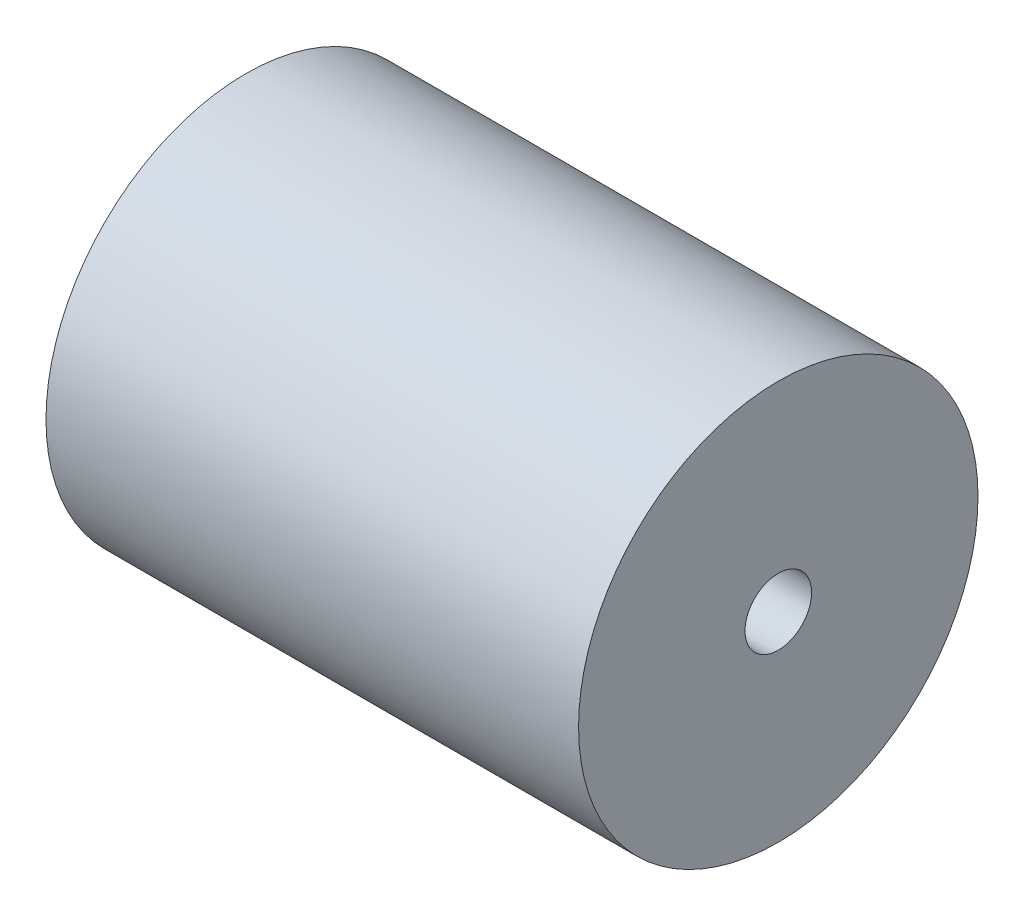
ISO-10303-21;
HEADER;
FILE_DESCRIPTION(('STEP AP214'),'2;1');
FILE_NAME('part.step','',(''),(''),'','','');
FILE_SCHEMA(('AUTOMOTIVE_DESIGN { 1 0 10303 214 1 1 1 1 }'));
ENDSEC;
DATA;
#1=APPLICATION_CONTEXT('core data for automotive mechanical design processes');
#2=APPLICATION_PROTOCOL_DEFINITION('international standard','automotive_design',2000,#1);
#3=PRODUCT_CONTEXT('',#1,'mechanical');
#4=PRODUCT('Part','Part','',(#3));
#5=PRODUCT_RELATED_PRODUCT_CATEGORY('part','',(#4));
#6=PRODUCT_DEFINITION_FORMATION('','',#4);
#7=PRODUCT_DEFINITION_CONTEXT('part definition',#1,'design');
#8=PRODUCT_DEFINITION('design','',#6,#7);
#9=PRODUCT_DEFINITION_SHAPE('','',#8);
#10=(LENGTH_UNIT() NAMED_UNIT(*) SI_UNIT(.MILLI.,.METRE.));
#11=(NAMED_UNIT(*) PLANE_ANGLE_UNIT() SI_UNIT($,.RADIAN.));
#12=(NAMED_UNIT(*) SI_UNIT($,.STERADIAN.) SOLID_ANGLE_UNIT());
#13=UNCERTAINTY_MEASURE_WITH_UNIT(LENGTH_MEASURE(1.E-05),#10,'distance_accuracy_value','');
#14=(GEOMETRIC_REPRESENTATION_CONTEXT(3) GLOBAL_UNCERTAINTY_ASSIGNED_CONTEXT((#13)) GLOBAL_UNIT_ASSIGNED_CONTEXT((#10,
#11,#12)) REPRESENTATION_CONTEXT('',''));
#15=CARTESIAN_POINT('',(0.,0.,0.));
#16=DIRECTION('',(0.,0.,1.));
#17=DIRECTION('',(1.,0.,0.));
#18=AXIS2_PLACEMENT_3D('',#15,#16,#17);
#19=CARTESIAN_POINT('',(4.,0.,0.));
#20=DIRECTION('',(-1.,0.,0.));
#21=DIRECTION('',(0.,0.,1.));
#22=AXIS2_PLACEMENT_3D('',#19,#20,#21);
#23=CYLINDRICAL_SURFACE('',#22,1.5);
#24=CARTESIAN_POINT('',(4.,0.,0.));
#25=DIRECTION('',(1.,0.,0.));
#26=DIRECTION('',(0.,0.,-1.));
#27=AXIS2_PLACEMENT_3D('',#24,#25,#26);
#28=CIRCLE('',#27,1.5);
#29=CARTESIAN_POINT('',(4.,0.,-1.5));
#30=VERTEX_POINT('',#29);
#31=EDGE_CURVE('E10',#30,#30,#28,.T.);
#32=ORIENTED_EDGE('',*,*,#31,.F.);
#33=EDGE_LOOP('',(#32));
#34=FACE_BOUND('',#33,.T.);
#35=CARTESIAN_POINT('',(0.,0.,0.));
#36=DIRECTION('',(1.,0.,0.));
#37=DIRECTION('',(0.,0.,-1.));
#38=AXIS2_PLACEMENT_3D('',#35,#36,#37);
#39=CIRCLE('',#38,1.5);
#40=CARTESIAN_POINT('',(0.,0.,-1.5));
#41=VERTEX_POINT('',#40);
#42=EDGE_CURVE('E35',#41,#41,#39,.T.);
#43=ORIENTED_EDGE('',*,*,#42,.T.);
#44=EDGE_LOOP('',(#43));
#45=FACE_BOUND('',#44,.T.);
#46=ADVANCED_FACE('F32',(#34,#45),#23,.T.);
#47=CARTESIAN_POINT('',(4.,0.,0.));
#48=DIRECTION('',(1.,0.,0.));
#49=DIRECTION('',(0.,0.,-1.));
#50=AXIS2_PLACEMENT_3D('',#47,#48,#49);
#51=PLANE('',#50);
#52=CARTESIAN_POINT('',(4.,0.,0.));
#53=DIRECTION('',(1.,0.,0.));
#54=DIRECTION('',(0.,0.,-1.));
#55=AXIS2_PLACEMENT_3D('',#52,#53,#54);
#56=CIRCLE('',#55,0.25);
#57=CARTESIAN_POINT('',(4.,0.,-0.25));
#58=VERTEX_POINT('',#57);
#59=EDGE_CURVE('E44',#58,#58,#56,.T.);
#60=ORIENTED_EDGE('',*,*,#59,.F.);
#61=EDGE_LOOP('',(#60));
#62=FACE_BOUND('',#61,.T.);
#63=ORIENTED_EDGE('',*,*,#31,.T.);
#64=EDGE_LOOP('',(#63));
#65=FACE_BOUND('',#64,.T.);
#66=ADVANCED_FACE('F59',(#62,#65),#51,.T.);
#67=CARTESIAN_POINT('',(0.,0.,0.));
#68=DIRECTION('',(1.,0.,0.));
#69=DIRECTION('',(0.,0.,-1.));
#70=AXIS2_PLACEMENT_3D('',#67,#68,#69);
#71=PLANE('',#70);
#72=CARTESIAN_POINT('',(0.,0.,0.));
#73=DIRECTION('',(1.,0.,0.));
#74=DIRECTION('',(0.,0.,-1.));
#75=AXIS2_PLACEMENT_3D('',#72,#73,#74);
#76=CIRCLE('',#75,0.25);
#77=CARTESIAN_POINT('',(0.,0.,-0.25));
#78=VERTEX_POINT('',#77);
#79=EDGE_CURVE('E42',#78,#78,#76,.T.);
#80=ORIENTED_EDGE('',*,*,#79,.T.);
#81=EDGE_LOOP('',(#80));
#82=FACE_BOUND('',#81,.T.);
#83=ORIENTED_EDGE('',*,*,#42,.F.);
#84=EDGE_LOOP('',(#83));
#85=FACE_BOUND('',#84,.T.);
#86=ADVANCED_FACE('F50',(#82,#85),#71,.F.);
#87=CARTESIAN_POINT('',(0.,0.,0.));
#88=DIRECTION('',(1.,0.,0.));
#89=DIRECTION('',(0.,0.,-1.));
#90=AXIS2_PLACEMENT_3D('',#87,#88,#89);
#91=CYLINDRICAL_SURFACE('',#90,0.25);
#92=ORIENTED_EDGE('',*,*,#79,.F.);
#93=EDGE_LOOP('',(#92));
#94=FACE_BOUND('',#93,.T.);
#95=ORIENTED_EDGE('',*,*,#59,.T.);
#96=EDGE_LOOP('',(#95));
#97=FACE_BOUND('',#96,.T.);
#98=ADVANCED_FACE('F53',(#94,#97),#91,.F.);
#99=CLOSED_SHELL('',(#46,#66,#86,#98));
#100=MANIFOLD_SOLID_BREP('B2',#99);
#101=ADVANCED_BREP_SHAPE_REPRESENTATION('',(#18,#100),#14);
#102=SHAPE_DEFINITION_REPRESENTATION(#9,#101);
ENDSEC;
END-ISO-10303-21;
